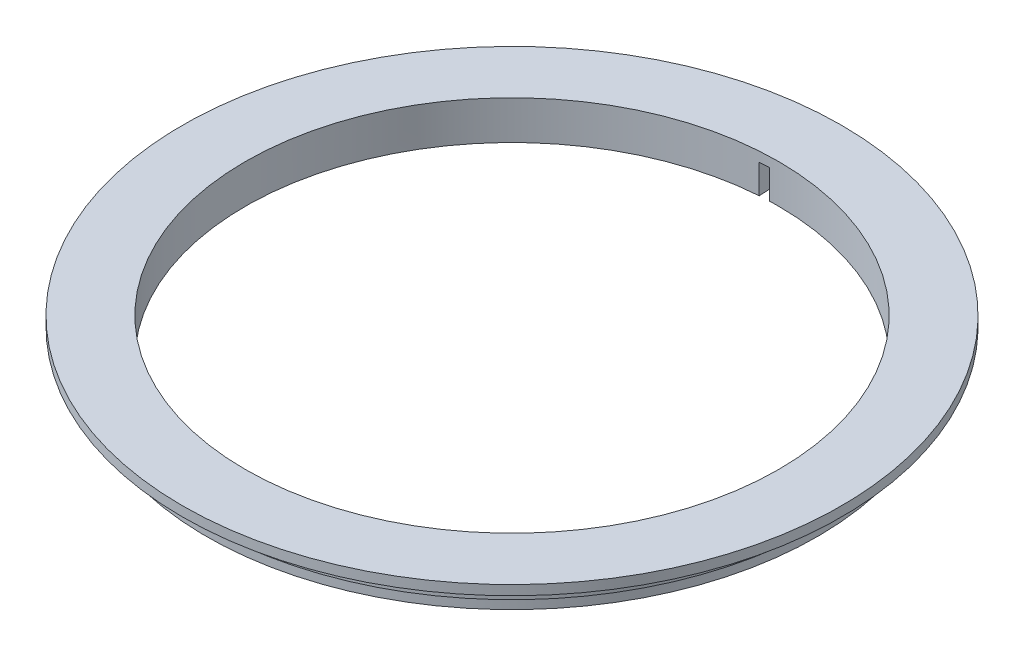
ISO-10303-21;
HEADER;
FILE_DESCRIPTION(('STEP AP214'),'2;1');
FILE_NAME('part.step','',(''),(''),'','','');
FILE_SCHEMA(('AUTOMOTIVE_DESIGN { 1 0 10303 214 1 1 1 1 }'));
ENDSEC;
DATA;
#1=APPLICATION_CONTEXT('core data for automotive mechanical design processes');
#2=APPLICATION_PROTOCOL_DEFINITION('international standard','automotive_design',2000,#1);
#3=PRODUCT_CONTEXT('',#1,'mechanical');
#4=PRODUCT('Part','Part','',(#3));
#5=PRODUCT_RELATED_PRODUCT_CATEGORY('part','',(#4));
#6=PRODUCT_DEFINITION_FORMATION('','',#4);
#7=PRODUCT_DEFINITION_CONTEXT('part definition',#1,'design');
#8=PRODUCT_DEFINITION('design','',#6,#7);
#9=PRODUCT_DEFINITION_SHAPE('','',#8);
#10=(LENGTH_UNIT() NAMED_UNIT(*) SI_UNIT(.MILLI.,.METRE.));
#11=(NAMED_UNIT(*) PLANE_ANGLE_UNIT() SI_UNIT($,.RADIAN.));
#12=(NAMED_UNIT(*) SI_UNIT($,.STERADIAN.) SOLID_ANGLE_UNIT());
#13=UNCERTAINTY_MEASURE_WITH_UNIT(LENGTH_MEASURE(1.E-05),#10,'distance_accuracy_value','');
#14=(GEOMETRIC_REPRESENTATION_CONTEXT(3) GLOBAL_UNCERTAINTY_ASSIGNED_CONTEXT((#13)) GLOBAL_UNIT_ASSIGNED_CONTEXT((#10,
#11,#12)) REPRESENTATION_CONTEXT('',''));
#15=CARTESIAN_POINT('',(0.,0.,0.));
#16=DIRECTION('',(0.,0.,1.));
#17=DIRECTION('',(1.,0.,0.));
#18=AXIS2_PLACEMENT_3D('',#15,#16,#17);
#19=CARTESIAN_POINT('',(0.,0.,0.));
#20=DIRECTION('',(0.,-1.,0.));
#21=DIRECTION('',(0.,0.,-1.));
#22=AXIS2_PLACEMENT_3D('',#19,#20,#21);
#23=CYLINDRICAL_SURFACE('',#22,137.568040744867);
#24=CARTESIAN_POINT('',(0.,20.,0.));
#25=DIRECTION('',(0.,-1.,0.));
#26=DIRECTION('',(0.,0.,-1.));
#27=AXIS2_PLACEMENT_3D('',#24,#25,#26);
#28=CIRCLE('',#27,137.568040744867);
#29=CARTESIAN_POINT('',(0.,20.,-137.568040744867));
#30=VERTEX_POINT('',#29);
#31=EDGE_CURVE('E111',#30,#30,#28,.T.);
#32=ORIENTED_EDGE('',*,*,#31,.F.);
#33=EDGE_LOOP('',(#32));
#34=FACE_BOUND('',#33,.T.);
#35=CARTESIAN_POINT('',(0.,0.,0.));
#36=DIRECTION('',(0.,-1.,0.));
#37=DIRECTION('',(0.,0.,-1.));
#38=AXIS2_PLACEMENT_3D('',#35,#36,#37);
#39=CIRCLE('',#38,137.568040744867);
#40=CARTESIAN_POINT('',(-4.70199216054036,0.,-137.487661643159));
#41=VERTEX_POINT('',#40);
#42=CARTESIAN_POINT('',(-9.69513983431322,0.,-137.225981861944));
#43=VERTEX_POINT('',#42);
#44=EDGE_CURVE('E11',#41,#43,#39,.T.);
#45=ORIENTED_EDGE('',*,*,#44,.T.);
#46=DIRECTION('',(0.,-1.,0.));
#47=VECTOR('',#46,1.);
#48=CARTESIAN_POINT('',(-9.69513983431323,0.,-137.225981861944));
#49=LINE('',#48,#47);
#50=CARTESIAN_POINT('',(-9.69513983431323,15.,-137.225981861944));
#51=VERTEX_POINT('',#50);
#52=EDGE_CURVE('E54',#43,#51,#49,.F.);
#53=ORIENTED_EDGE('',*,*,#52,.T.);
#54=CARTESIAN_POINT('',(0.,15.,0.));
#55=DIRECTION('',(0.,-1.,0.));
#56=DIRECTION('',(0.,0.,-1.));
#57=AXIS2_PLACEMENT_3D('',#54,#55,#56);
#58=CIRCLE('',#57,137.568040744867);
#59=CARTESIAN_POINT('',(-4.70199216054036,15.,-137.487661643159));
#60=VERTEX_POINT('',#59);
#61=EDGE_CURVE('E97',#51,#60,#58,.T.);
#62=ORIENTED_EDGE('',*,*,#61,.T.);
#63=DIRECTION('',(0.,-1.,0.));
#64=VECTOR('',#63,1.);
#65=CARTESIAN_POINT('',(-4.70199216054036,0.,-137.487661643159));
#66=LINE('',#65,#64);
#67=EDGE_CURVE('E162',#41,#60,#66,.F.);
#68=ORIENTED_EDGE('',*,*,#67,.F.);
#69=EDGE_LOOP('',(#45,#53,#62,#68));
#70=FACE_BOUND('',#69,.T.);
#71=ADVANCED_FACE('F33',(#34,#70),#23,.F.);
#72=CARTESIAN_POINT('',(137.568040744867,0.,0.));
#73=DIRECTION('',(0.,-1.,0.));
#74=DIRECTION('',(0.,0.,-1.));
#75=AXIS2_PLACEMENT_3D('',#72,#73,#74);
#76=PLANE('',#75);
#77=CARTESIAN_POINT('',(0.,0.,0.));
#78=DIRECTION('',(0.,-1.,0.));
#79=DIRECTION('',(0.,0.,-1.));
#80=AXIS2_PLACEMENT_3D('',#77,#78,#79);
#81=CIRCLE('',#80,157.568040744867);
#82=CARTESIAN_POINT('',(-5.74886222006599,0.,-157.46313234326));
#83=VERTEX_POINT('',#82);
#84=CARTESIAN_POINT('',(-10.7420098938389,0.,-157.201452562045));
#85=VERTEX_POINT('',#84);
#86=EDGE_CURVE('E40',#83,#85,#81,.T.);
#87=ORIENTED_EDGE('',*,*,#86,.T.);
#88=DIRECTION('',(0.0523359562429381,0.,0.998629534754574));
#89=VECTOR('',#88,1.);
#90=CARTESIAN_POINT('',(-2.11976777629536,0.,7.320727837508));
#91=LINE('',#90,#89);
#92=EDGE_CURVE('E112',#85,#43,#91,.T.);
#93=ORIENTED_EDGE('',*,*,#92,.T.);
#94=ORIENTED_EDGE('',*,*,#44,.F.);
#95=DIRECTION('',(0.0523359562429378,0.,0.998629534754574));
#96=VECTOR('',#95,1.);
#97=CARTESIAN_POINT('',(2.87337989747746,0.,7.05904805629327));
#98=LINE('',#97,#96);
#99=EDGE_CURVE('E144',#83,#41,#98,.T.);
#100=ORIENTED_EDGE('',*,*,#99,.F.);
#101=EDGE_LOOP('',(#87,#93,#94,#100));
#102=FACE_BOUND('',#101,.T.);
#103=ADVANCED_FACE('F143',(#102),#76,.T.);
#104=CARTESIAN_POINT('',(0.,0.,0.));
#105=DIRECTION('',(0.,-1.,0.));
#106=DIRECTION('',(0.,0.,-1.));
#107=AXIS2_PLACEMENT_3D('',#104,#105,#106);
#108=CYLINDRICAL_SURFACE('',#107,157.568040744867);
#109=CARTESIAN_POINT('',(0.,5.,0.));
#110=DIRECTION('',(0.,-1.,0.));
#111=DIRECTION('',(0.,0.,-1.));
#112=AXIS2_PLACEMENT_3D('',#109,#110,#111);
#113=CIRCLE('',#112,157.568040744867);
#114=CARTESIAN_POINT('',(-5.74886222006602,5.,-157.46313234326));
#115=VERTEX_POINT('',#114);
#116=CARTESIAN_POINT('',(-10.7420098938389,5.,-157.201452562045));
#117=VERTEX_POINT('',#116);
#118=EDGE_CURVE('E137',#115,#117,#113,.T.);
#119=ORIENTED_EDGE('',*,*,#118,.T.);
#120=DIRECTION('',(0.,-1.,0.));
#121=VECTOR('',#120,1.);
#122=CARTESIAN_POINT('',(-10.7420098938389,0.,-157.201452562045));
#123=LINE('',#122,#121);
#124=EDGE_CURVE('E117',#117,#85,#123,.T.);
#125=ORIENTED_EDGE('',*,*,#124,.T.);
#126=ORIENTED_EDGE('',*,*,#86,.F.);
#127=DIRECTION('',(0.,-1.,0.));
#128=VECTOR('',#127,1.);
#129=CARTESIAN_POINT('',(-5.74886222006599,0.,-157.46313234326));
#130=LINE('',#129,#128);
#131=EDGE_CURVE('E149',#115,#83,#130,.T.);
#132=ORIENTED_EDGE('',*,*,#131,.F.);
#133=EDGE_LOOP('',(#119,#125,#126,#132));
#134=FACE_BOUND('',#133,.T.);
#135=ADVANCED_FACE('F148',(#134),#108,.T.);
#136=CARTESIAN_POINT('',(157.568040744867,5.,0.));
#137=DIRECTION('',(0.,-1.,0.));
#138=DIRECTION('',(0.,0.,-1.));
#139=AXIS2_PLACEMENT_3D('',#136,#137,#138);
#140=PLANE('',#139);
#141=CARTESIAN_POINT('',(0.,5.,0.));
#142=DIRECTION('',(0.,-1.,0.));
#143=DIRECTION('',(0.,0.,-1.));
#144=AXIS2_PLACEMENT_3D('',#141,#142,#143);
#145=CIRCLE('',#144,158.363838930448);
#146=CARTESIAN_POINT('',(-5.79051629596137,5.,-158.25793945902));
#147=VERTEX_POINT('',#146);
#148=CARTESIAN_POINT('',(-10.7836639697342,5.,-157.996259677806));
#149=VERTEX_POINT('',#148);
#150=EDGE_CURVE('E134',#147,#149,#145,.T.);
#151=ORIENTED_EDGE('',*,*,#150,.T.);
#152=DIRECTION('',(0.0523359562429381,0.,0.998629534754574));
#153=VECTOR('',#152,1.);
#154=CARTESIAN_POINT('',(-2.06498672997812,5.,8.36601247018443));
#155=LINE('',#154,#153);
#156=EDGE_CURVE('E152',#149,#117,#155,.T.);
#157=ORIENTED_EDGE('',*,*,#156,.T.);
#158=ORIENTED_EDGE('',*,*,#118,.F.);
#159=DIRECTION('',(0.0523359562429378,0.,0.998629534754574));
#160=VECTOR('',#159,1.);
#161=CARTESIAN_POINT('',(2.92816094379469,5.,8.1043326889697));
#162=LINE('',#161,#160);
#163=EDGE_CURVE('E166',#147,#115,#162,.T.);
#164=ORIENTED_EDGE('',*,*,#163,.F.);
#165=EDGE_LOOP('',(#151,#157,#158,#164));
#166=FACE_BOUND('',#165,.T.);
#167=ADVANCED_FACE('F189',(#166),#140,.T.);
#168=CARTESIAN_POINT('',(0.,0.,0.));
#169=DIRECTION('',(0.,-1.,0.));
#170=DIRECTION('',(0.,0.,-1.));
#171=AXIS2_PLACEMENT_3D('',#168,#169,#170);
#172=CYLINDRICAL_SURFACE('',#171,158.363838930448);
#173=CARTESIAN_POINT('',(0.,10.,0.));
#174=DIRECTION('',(0.,-1.,0.));
#175=DIRECTION('',(0.,0.,-1.));
#176=AXIS2_PLACEMENT_3D('',#173,#174,#175);
#177=CIRCLE('',#176,158.363838930448);
#178=CARTESIAN_POINT('',(-5.79051629596136,10.,-158.25793945902));
#179=VERTEX_POINT('',#178);
#180=CARTESIAN_POINT('',(-10.7836639697343,10.,-157.996259677806));
#181=VERTEX_POINT('',#180);
#182=EDGE_CURVE('E131',#179,#181,#177,.T.);
#183=ORIENTED_EDGE('',*,*,#182,.T.);
#184=DIRECTION('',(0.,-1.,0.));
#185=VECTOR('',#184,1.);
#186=CARTESIAN_POINT('',(-10.7836639697342,0.,-157.996259677806));
#187=LINE('',#186,#185);
#188=EDGE_CURVE('E153',#181,#149,#187,.T.);
#189=ORIENTED_EDGE('',*,*,#188,.T.);
#190=ORIENTED_EDGE('',*,*,#150,.F.);
#191=DIRECTION('',(0.,-1.,0.));
#192=VECTOR('',#191,1.);
#193=CARTESIAN_POINT('',(-5.79051629596137,0.,-158.25793945902));
#194=LINE('',#193,#192);
#195=EDGE_CURVE('E168',#179,#147,#194,.T.);
#196=ORIENTED_EDGE('',*,*,#195,.F.);
#197=EDGE_LOOP('',(#183,#189,#190,#196));
#198=FACE_BOUND('',#197,.T.);
#199=ADVANCED_FACE('F187',(#198),#172,.T.);
#200=CARTESIAN_POINT('',(158.363838930448,10.,0.));
#201=DIRECTION('',(0.,-1.,0.));
#202=DIRECTION('',(0.,0.,-1.));
#203=AXIS2_PLACEMENT_3D('',#200,#201,#202);
#204=PLANE('',#203);
#205=CARTESIAN_POINT('',(0.,10.,0.));
#206=DIRECTION('',(0.,-1.,0.));
#207=DIRECTION('',(0.,0.,-1.));
#208=AXIS2_PLACEMENT_3D('',#205,#206,#207);
#209=CIRCLE('',#208,159.159637116028);
#210=CARTESIAN_POINT('',(-5.83217031967827,10.,-159.052745579157));
#211=VERTEX_POINT('',#210);
#212=CARTESIAN_POINT('',(-10.8253179934511,10.,-158.791065797942));
#213=VERTEX_POINT('',#212);
#214=EDGE_CURVE('E128',#211,#213,#209,.T.);
#215=ORIENTED_EDGE('',*,*,#214,.T.);
#216=DIRECTION('',(0.0523359562429381,0.,0.998629534754574));
#217=VECTOR('',#216,1.);
#218=CARTESIAN_POINT('',(-2.06280699711495,10.,8.40760425088937));
#219=LINE('',#218,#217);
#220=EDGE_CURVE('E158',#213,#181,#219,.T.);
#221=ORIENTED_EDGE('',*,*,#220,.T.);
#222=ORIENTED_EDGE('',*,*,#182,.F.);
#223=DIRECTION('',(0.0523359562429378,0.,0.998629534754574));
#224=VECTOR('',#223,1.);
#225=CARTESIAN_POINT('',(2.9303406766579,10.,8.14592446967464));
#226=LINE('',#225,#224);
#227=EDGE_CURVE('E170',#211,#179,#226,.T.);
#228=ORIENTED_EDGE('',*,*,#227,.F.);
#229=EDGE_LOOP('',(#215,#221,#222,#228));
#230=FACE_BOUND('',#229,.T.);
#231=ADVANCED_FACE('F181',(#230),#204,.T.);
#232=CARTESIAN_POINT('',(0.,0.,0.));
#233=DIRECTION('',(0.,-1.,0.));
#234=DIRECTION('',(0.,0.,-1.));
#235=AXIS2_PLACEMENT_3D('',#232,#233,#234);
#236=CYLINDRICAL_SURFACE('',#235,159.159637116028);
#237=CARTESIAN_POINT('',(0.,15.,0.));
#238=DIRECTION('',(0.,-1.,0.));
#239=DIRECTION('',(0.,0.,-1.));
#240=AXIS2_PLACEMENT_3D('',#237,#238,#239);
#241=CIRCLE('',#240,159.159637116028);
#242=CARTESIAN_POINT('',(-5.83217031967827,15.,-159.052745579157));
#243=VERTEX_POINT('',#242);
#244=CARTESIAN_POINT('',(-10.8253179934511,15.,-158.791065797942));
#245=VERTEX_POINT('',#244);
#246=EDGE_CURVE('E126',#243,#245,#241,.T.);
#247=ORIENTED_EDGE('',*,*,#246,.T.);
#248=DIRECTION('',(0.,-1.,0.));
#249=VECTOR('',#248,1.);
#250=CARTESIAN_POINT('',(-10.8253179934511,0.,-158.791065797942));
#251=LINE('',#250,#249);
#252=EDGE_CURVE('E107',#245,#213,#251,.T.);
#253=ORIENTED_EDGE('',*,*,#252,.T.);
#254=ORIENTED_EDGE('',*,*,#214,.F.);
#255=DIRECTION('',(0.,-1.,0.));
#256=VECTOR('',#255,1.);
#257=CARTESIAN_POINT('',(-5.83217031967827,0.,-159.052745579157));
#258=LINE('',#257,#256);
#259=EDGE_CURVE('E103',#243,#211,#258,.T.);
#260=ORIENTED_EDGE('',*,*,#259,.F.);
#261=EDGE_LOOP('',(#247,#253,#254,#260));
#262=FACE_BOUND('',#261,.T.);
#263=ADVANCED_FACE('F179',(#262),#236,.T.);
#264=CARTESIAN_POINT('',(170.,15.,0.));
#265=DIRECTION('',(0.,-1.,0.));
#266=DIRECTION('',(0.,0.,-1.));
#267=AXIS2_PLACEMENT_3D('',#264,#265,#266);
#268=PLANE('',#267);
#269=ORIENTED_EDGE('',*,*,#246,.F.);
#270=DIRECTION('',(-0.0523359562429378,0.,-0.998629534754574));
#271=VECTOR('',#270,1.);
#272=CARTESIAN_POINT('',(-4.41378953369739,15.,-131.988427926605));
#273=LINE('',#272,#271);
#274=EDGE_CURVE('E100',#60,#243,#273,.T.);
#275=ORIENTED_EDGE('',*,*,#274,.F.);
#276=ORIENTED_EDGE('',*,*,#61,.F.);
#277=DIRECTION('',(-0.0523359562429381,0.,-0.998629534754574));
#278=VECTOR('',#277,1.);
#279=CARTESIAN_POINT('',(-9.40693720747026,15.,-131.72674814539));
#280=LINE('',#279,#278);
#281=EDGE_CURVE('E47',#51,#245,#280,.T.);
#282=ORIENTED_EDGE('',*,*,#281,.T.);
#283=EDGE_LOOP('',(#269,#275,#276,#282));
#284=FACE_BOUND('',#283,.T.);
#285=CARTESIAN_POINT('',(0.,15.,0.));
#286=DIRECTION('',(0.,-1.,0.));
#287=DIRECTION('',(0.,0.,-1.));
#288=AXIS2_PLACEMENT_3D('',#285,#286,#287);
#289=CIRCLE('',#288,170.);
#290=CARTESIAN_POINT('',(0.,15.,-170.));
#291=VERTEX_POINT('',#290);
#292=EDGE_CURVE('E123',#291,#291,#289,.T.);
#293=ORIENTED_EDGE('',*,*,#292,.T.);
#294=EDGE_LOOP('',(#293));
#295=FACE_BOUND('',#294,.T.);
#296=ADVANCED_FACE('F98',(#284,#295),#268,.T.);
#297=CARTESIAN_POINT('',(0.,0.,0.));
#298=DIRECTION('',(0.,-1.,0.));
#299=DIRECTION('',(0.,0.,-1.));
#300=AXIS2_PLACEMENT_3D('',#297,#298,#299);
#301=CYLINDRICAL_SURFACE('',#300,170.);
#302=CARTESIAN_POINT('',(0.,20.,0.));
#303=DIRECTION('',(0.,-1.,0.));
#304=DIRECTION('',(0.,0.,-1.));
#305=AXIS2_PLACEMENT_3D('',#302,#303,#304);
#306=CIRCLE('',#305,170.);
#307=CARTESIAN_POINT('',(0.,20.,-170.));
#308=VERTEX_POINT('',#307);
#309=EDGE_CURVE('E115',#308,#308,#306,.T.);
#310=ORIENTED_EDGE('',*,*,#309,.T.);
#311=EDGE_LOOP('',(#310));
#312=FACE_BOUND('',#311,.T.);
#313=ORIENTED_EDGE('',*,*,#292,.F.);
#314=EDGE_LOOP('',(#313));
#315=FACE_BOUND('',#314,.T.);
#316=ADVANCED_FACE('F208',(#312,#315),#301,.T.);
#317=CARTESIAN_POINT('',(137.568040744867,20.,0.));
#318=DIRECTION('',(0.,1.,0.));
#319=DIRECTION('',(0.,0.,1.));
#320=AXIS2_PLACEMENT_3D('',#317,#318,#319);
#321=PLANE('',#320);
#322=ORIENTED_EDGE('',*,*,#31,.T.);
#323=EDGE_LOOP('',(#322));
#324=FACE_BOUND('',#323,.T.);
#325=ORIENTED_EDGE('',*,*,#309,.F.);
#326=EDGE_LOOP('',(#325));
#327=FACE_BOUND('',#326,.T.);
#328=ADVANCED_FACE('F205',(#324,#327),#321,.T.);
#329=CARTESIAN_POINT('',(-9.40693720747026,-5.39570236490653,-131.72674814539));
#330=DIRECTION('',(0.998629534754574,0.,-0.0523359562429381));
#331=DIRECTION('',(-0.0523359562429381,0.,-0.998629534754574));
#332=AXIS2_PLACEMENT_3D('',#329,#330,#331);
#333=PLANE('',#332);
#334=ORIENTED_EDGE('',*,*,#92,.F.);
#335=ORIENTED_EDGE('',*,*,#124,.F.);
#336=ORIENTED_EDGE('',*,*,#156,.F.);
#337=ORIENTED_EDGE('',*,*,#188,.F.);
#338=ORIENTED_EDGE('',*,*,#220,.F.);
#339=ORIENTED_EDGE('',*,*,#252,.F.);
#340=ORIENTED_EDGE('',*,*,#281,.F.);
#341=ORIENTED_EDGE('',*,*,#52,.F.);
#342=EDGE_LOOP('',(#334,#335,#336,#337,#338,#339,#340,#341));
#343=FACE_BOUND('',#342,.T.);
#344=ADVANCED_FACE('F105',(#343),#333,.T.);
#345=CARTESIAN_POINT('',(-4.41378953369739,-5.39570236490653,-131.988427926605));
#346=DIRECTION('',(0.998629534754574,0.,-0.0523359562429378));
#347=DIRECTION('',(-0.0523359562429378,0.,-0.998629534754574));
#348=AXIS2_PLACEMENT_3D('',#345,#346,#347);
#349=PLANE('',#348);
#350=ORIENTED_EDGE('',*,*,#67,.T.);
#351=ORIENTED_EDGE('',*,*,#274,.T.);
#352=ORIENTED_EDGE('',*,*,#259,.T.);
#353=ORIENTED_EDGE('',*,*,#227,.T.);
#354=ORIENTED_EDGE('',*,*,#195,.T.);
#355=ORIENTED_EDGE('',*,*,#163,.T.);
#356=ORIENTED_EDGE('',*,*,#131,.T.);
#357=ORIENTED_EDGE('',*,*,#99,.T.);
#358=EDGE_LOOP('',(#350,#351,#352,#353,#354,#355,#356,#357));
#359=FACE_BOUND('',#358,.T.);
#360=ADVANCED_FACE('F175',(#359),#349,.F.);
#361=CLOSED_SHELL('',(#71,#103,#135,#167,#199,#231,#263,#296,#316,#328,#344,#360));
#362=MANIFOLD_SOLID_BREP('B2',#361);
#363=ADVANCED_BREP_SHAPE_REPRESENTATION('',(#18,#362),#14);
#364=SHAPE_DEFINITION_REPRESENTATION(#9,#363);
ENDSEC;
END-ISO-10303-21;
